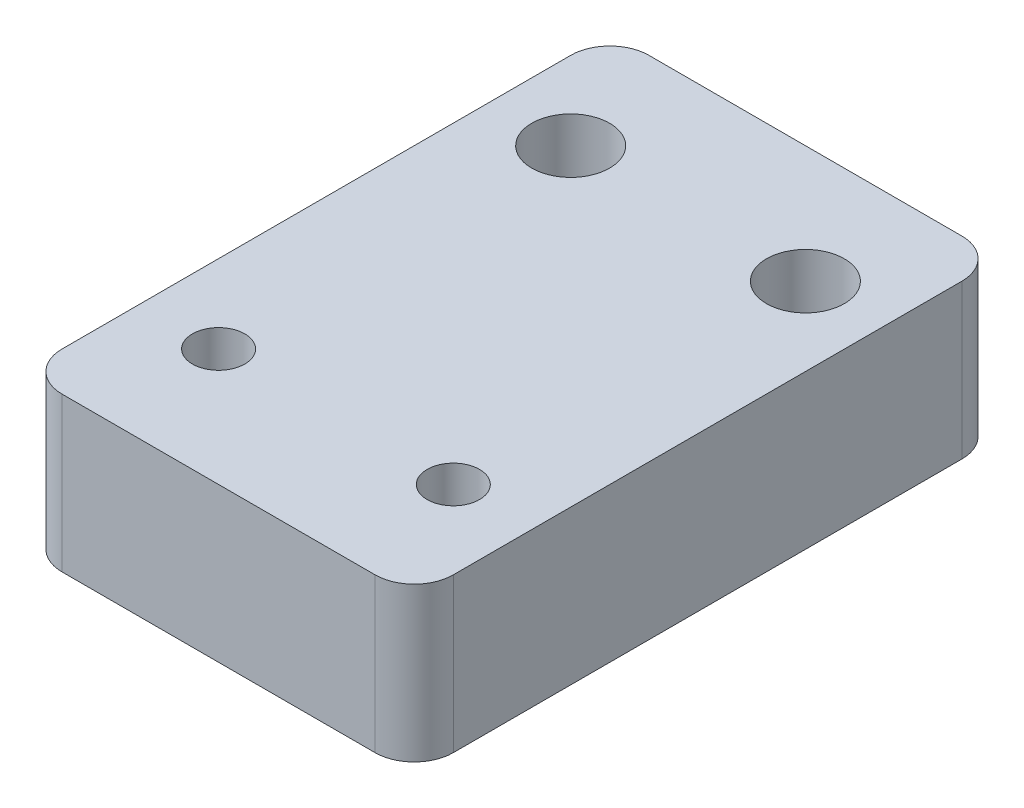
ISO-10303-21;
HEADER;
FILE_DESCRIPTION(('STEP AP214'),'2;1');
FILE_NAME('part.step','',(''),(''),'','','');
FILE_SCHEMA(('AUTOMOTIVE_DESIGN { 1 0 10303 214 1 1 1 1 }'));
ENDSEC;
DATA;
#1=APPLICATION_CONTEXT('core data for automotive mechanical design processes');
#2=APPLICATION_PROTOCOL_DEFINITION('international standard','automotive_design',2000,#1);
#3=PRODUCT_CONTEXT('',#1,'mechanical');
#4=PRODUCT('Part','Part','',(#3));
#5=PRODUCT_RELATED_PRODUCT_CATEGORY('part','',(#4));
#6=PRODUCT_DEFINITION_FORMATION('','',#4);
#7=PRODUCT_DEFINITION_CONTEXT('part definition',#1,'design');
#8=PRODUCT_DEFINITION('design','',#6,#7);
#9=PRODUCT_DEFINITION_SHAPE('','',#8);
#10=(LENGTH_UNIT() NAMED_UNIT(*) SI_UNIT(.MILLI.,.METRE.));
#11=(NAMED_UNIT(*) PLANE_ANGLE_UNIT() SI_UNIT($,.RADIAN.));
#12=(NAMED_UNIT(*) SI_UNIT($,.STERADIAN.) SOLID_ANGLE_UNIT());
#13=UNCERTAINTY_MEASURE_WITH_UNIT(LENGTH_MEASURE(1.E-05),#10,'distance_accuracy_value','');
#14=(GEOMETRIC_REPRESENTATION_CONTEXT(3) GLOBAL_UNCERTAINTY_ASSIGNED_CONTEXT((#13)) GLOBAL_UNIT_ASSIGNED_CONTEXT((#10,
#11,#12)) REPRESENTATION_CONTEXT('',''));
#15=CARTESIAN_POINT('',(0.,0.,0.));
#16=DIRECTION('',(0.,0.,1.));
#17=DIRECTION('',(1.,0.,0.));
#18=AXIS2_PLACEMENT_3D('',#15,#16,#17);
#19=CARTESIAN_POINT('',(0.,10.,0.));
#20=DIRECTION('',(0.,-1.,0.));
#21=DIRECTION('',(0.,0.,-1.));
#22=AXIS2_PLACEMENT_3D('',#19,#20,#21);
#23=PLANE('',#22);
#24=DIRECTION('',(1.,0.,0.));
#25=VECTOR('',#24,1.);
#26=CARTESIAN_POINT('',(-12.7,10.,19.05));
#27=LINE('',#26,#25);
#28=CARTESIAN_POINT('',(-10.16,10.,19.05));
#29=VERTEX_POINT('',#28);
#30=CARTESIAN_POINT('',(10.16,10.,19.05));
#31=VERTEX_POINT('',#30);
#32=EDGE_CURVE('E143',#29,#31,#27,.T.);
#33=ORIENTED_EDGE('',*,*,#32,.T.);
#34=CARTESIAN_POINT('',(10.16,10.,16.51));
#35=DIRECTION('',(0.,-1.,0.));
#36=DIRECTION('',(0.,0.,-1.));
#37=AXIS2_PLACEMENT_3D('',#34,#35,#36);
#38=CIRCLE('',#37,2.54);
#39=CARTESIAN_POINT('',(12.7,10.,16.51));
#40=VERTEX_POINT('',#39);
#41=EDGE_CURVE('E161',#31,#40,#38,.F.);
#42=ORIENTED_EDGE('',*,*,#41,.T.);
#43=DIRECTION('',(0.,0.,-1.));
#44=VECTOR('',#43,1.);
#45=CARTESIAN_POINT('',(12.7,10.,19.05));
#46=LINE('',#45,#44);
#47=CARTESIAN_POINT('',(12.7,10.,-16.51));
#48=VERTEX_POINT('',#47);
#49=EDGE_CURVE('E125',#40,#48,#46,.T.);
#50=ORIENTED_EDGE('',*,*,#49,.T.);
#51=CARTESIAN_POINT('',(10.16,10.,-16.51));
#52=DIRECTION('',(0.,-1.,0.));
#53=DIRECTION('',(0.,0.,-1.));
#54=AXIS2_PLACEMENT_3D('',#51,#52,#53);
#55=CIRCLE('',#54,2.54);
#56=CARTESIAN_POINT('',(10.16,10.,-19.05));
#57=VERTEX_POINT('',#56);
#58=EDGE_CURVE('E158',#48,#57,#55,.F.);
#59=ORIENTED_EDGE('',*,*,#58,.T.);
#60=DIRECTION('',(-1.,0.,0.));
#61=VECTOR('',#60,1.);
#62=CARTESIAN_POINT('',(-12.7,10.,-19.05));
#63=LINE('',#62,#61);
#64=CARTESIAN_POINT('',(-10.16,10.,-19.05));
#65=VERTEX_POINT('',#64);
#66=EDGE_CURVE('E172',#57,#65,#63,.T.);
#67=ORIENTED_EDGE('',*,*,#66,.T.);
#68=CARTESIAN_POINT('',(-10.16,10.,-16.51));
#69=DIRECTION('',(0.,-1.,0.));
#70=DIRECTION('',(0.,0.,-1.));
#71=AXIS2_PLACEMENT_3D('',#68,#69,#70);
#72=CIRCLE('',#71,2.54);
#73=CARTESIAN_POINT('',(-12.7,10.,-16.51));
#74=VERTEX_POINT('',#73);
#75=EDGE_CURVE('E61',#65,#74,#72,.F.);
#76=ORIENTED_EDGE('',*,*,#75,.T.);
#77=DIRECTION('',(0.,0.,1.));
#78=VECTOR('',#77,1.);
#79=CARTESIAN_POINT('',(-12.7,10.,19.05));
#80=LINE('',#79,#78);
#81=CARTESIAN_POINT('',(-12.7,10.,16.51));
#82=VERTEX_POINT('',#81);
#83=EDGE_CURVE('E180',#74,#82,#80,.T.);
#84=ORIENTED_EDGE('',*,*,#83,.T.);
#85=CARTESIAN_POINT('',(-10.16,10.,16.51));
#86=DIRECTION('',(0.,-1.,0.));
#87=DIRECTION('',(0.,0.,-1.));
#88=AXIS2_PLACEMENT_3D('',#85,#86,#87);
#89=CIRCLE('',#88,2.54);
#90=EDGE_CURVE('E156',#82,#29,#89,.F.);
#91=ORIENTED_EDGE('',*,*,#90,.T.);
#92=EDGE_LOOP('',(#33,#42,#50,#59,#67,#76,#84,#91));
#93=FACE_BOUND('',#92,.T.);
#94=CARTESIAN_POINT('',(-7.62,10.,11.43));
#95=DIRECTION('',(0.,1.,0.));
#96=DIRECTION('',(0.,0.,1.));
#97=AXIS2_PLACEMENT_3D('',#94,#95,#96);
#98=CIRCLE('',#97,1.7);
#99=CARTESIAN_POINT('',(-7.62,10.,13.13));
#100=VERTEX_POINT('',#99);
#101=EDGE_CURVE('E134',#100,#100,#98,.T.);
#102=ORIENTED_EDGE('',*,*,#101,.F.);
#103=EDGE_LOOP('',(#102));
#104=FACE_BOUND('',#103,.T.);
#105=CARTESIAN_POINT('',(7.62,10.,11.43));
#106=DIRECTION('',(0.,1.,0.));
#107=DIRECTION('',(0.,0.,1.));
#108=AXIS2_PLACEMENT_3D('',#105,#106,#107);
#109=CIRCLE('',#108,1.7);
#110=CARTESIAN_POINT('',(7.62,10.,13.13));
#111=VERTEX_POINT('',#110);
#112=EDGE_CURVE('E187',#111,#111,#109,.T.);
#113=ORIENTED_EDGE('',*,*,#112,.F.);
#114=EDGE_LOOP('',(#113));
#115=FACE_BOUND('',#114,.T.);
#116=CARTESIAN_POINT('',(-7.62,10.,-11.43));
#117=DIRECTION('',(0.,1.,0.));
#118=DIRECTION('',(0.,0.,1.));
#119=AXIS2_PLACEMENT_3D('',#116,#117,#118);
#120=CIRCLE('',#119,2.5273);
#121=CARTESIAN_POINT('',(-7.62,10.,-8.9027));
#122=VERTEX_POINT('',#121);
#123=EDGE_CURVE('E192',#122,#122,#120,.T.);
#124=ORIENTED_EDGE('',*,*,#123,.F.);
#125=EDGE_LOOP('',(#124));
#126=FACE_BOUND('',#125,.T.);
#127=CARTESIAN_POINT('',(7.62,10.,-11.43));
#128=DIRECTION('',(0.,1.,0.));
#129=DIRECTION('',(0.,0.,1.));
#130=AXIS2_PLACEMENT_3D('',#127,#128,#129);
#131=CIRCLE('',#130,2.5273);
#132=CARTESIAN_POINT('',(7.62,10.,-8.9027));
#133=VERTEX_POINT('',#132);
#134=EDGE_CURVE('E198',#133,#133,#131,.T.);
#135=ORIENTED_EDGE('',*,*,#134,.F.);
#136=EDGE_LOOP('',(#135));
#137=FACE_BOUND('',#136,.T.);
#138=ADVANCED_FACE('F39',(#93,#104,#115,#126,#137),#23,.F.);
#139=CARTESIAN_POINT('',(0.,0.,0.));
#140=DIRECTION('',(0.,-1.,0.));
#141=DIRECTION('',(0.,0.,-1.));
#142=AXIS2_PLACEMENT_3D('',#139,#140,#141);
#143=PLANE('',#142);
#144=CARTESIAN_POINT('',(-7.62,0.,-11.43));
#145=DIRECTION('',(0.,1.,0.));
#146=DIRECTION('',(0.,0.,1.));
#147=AXIS2_PLACEMENT_3D('',#144,#145,#146);
#148=CIRCLE('',#147,2.5273);
#149=CARTESIAN_POINT('',(-7.62,0.,-8.9027));
#150=VERTEX_POINT('',#149);
#151=EDGE_CURVE('E195',#150,#150,#148,.T.);
#152=ORIENTED_EDGE('',*,*,#151,.T.);
#153=EDGE_LOOP('',(#152));
#154=FACE_BOUND('',#153,.T.);
#155=CARTESIAN_POINT('',(-7.62,0.,11.43));
#156=DIRECTION('',(0.,1.,0.));
#157=DIRECTION('',(0.,0.,1.));
#158=AXIS2_PLACEMENT_3D('',#155,#156,#157);
#159=CIRCLE('',#158,1.7);
#160=CARTESIAN_POINT('',(-7.62,0.,13.13));
#161=VERTEX_POINT('',#160);
#162=EDGE_CURVE('E140',#161,#161,#159,.T.);
#163=ORIENTED_EDGE('',*,*,#162,.T.);
#164=EDGE_LOOP('',(#163));
#165=FACE_BOUND('',#164,.T.);
#166=DIRECTION('',(0.,0.,-1.));
#167=VECTOR('',#166,1.);
#168=CARTESIAN_POINT('',(12.7,0.,19.05));
#169=LINE('',#168,#167);
#170=CARTESIAN_POINT('',(12.7,0.,16.51));
#171=VERTEX_POINT('',#170);
#172=CARTESIAN_POINT('',(12.7,0.,-16.51));
#173=VERTEX_POINT('',#172);
#174=EDGE_CURVE('E122',#171,#173,#169,.T.);
#175=ORIENTED_EDGE('',*,*,#174,.F.);
#176=CARTESIAN_POINT('',(10.16,0.,16.51));
#177=DIRECTION('',(0.,-1.,0.));
#178=DIRECTION('',(0.,0.,-1.));
#179=AXIS2_PLACEMENT_3D('',#176,#177,#178);
#180=CIRCLE('',#179,2.54);
#181=CARTESIAN_POINT('',(10.16,0.,19.05));
#182=VERTEX_POINT('',#181);
#183=EDGE_CURVE('E105',#171,#182,#180,.T.);
#184=ORIENTED_EDGE('',*,*,#183,.T.);
#185=DIRECTION('',(1.,0.,0.));
#186=VECTOR('',#185,1.);
#187=CARTESIAN_POINT('',(-12.7,0.,19.05));
#188=LINE('',#187,#186);
#189=CARTESIAN_POINT('',(-10.16,0.,19.05));
#190=VERTEX_POINT('',#189);
#191=EDGE_CURVE('E147',#190,#182,#188,.T.);
#192=ORIENTED_EDGE('',*,*,#191,.F.);
#193=CARTESIAN_POINT('',(-10.16,0.,16.51));
#194=DIRECTION('',(0.,-1.,0.));
#195=DIRECTION('',(0.,0.,-1.));
#196=AXIS2_PLACEMENT_3D('',#193,#194,#195);
#197=CIRCLE('',#196,2.54);
#198=CARTESIAN_POINT('',(-12.7,0.,16.51));
#199=VERTEX_POINT('',#198);
#200=EDGE_CURVE('E126',#190,#199,#197,.T.);
#201=ORIENTED_EDGE('',*,*,#200,.T.);
#202=DIRECTION('',(0.,0.,1.));
#203=VECTOR('',#202,1.);
#204=CARTESIAN_POINT('',(-12.7,0.,19.05));
#205=LINE('',#204,#203);
#206=CARTESIAN_POINT('',(-12.7,0.,-16.51));
#207=VERTEX_POINT('',#206);
#208=EDGE_CURVE('E137',#207,#199,#205,.T.);
#209=ORIENTED_EDGE('',*,*,#208,.F.);
#210=CARTESIAN_POINT('',(-10.16,0.,-16.51));
#211=DIRECTION('',(0.,-1.,0.));
#212=DIRECTION('',(0.,0.,-1.));
#213=AXIS2_PLACEMENT_3D('',#210,#211,#212);
#214=CIRCLE('',#213,2.54);
#215=CARTESIAN_POINT('',(-10.16,0.,-19.05));
#216=VERTEX_POINT('',#215);
#217=EDGE_CURVE('E116',#207,#216,#214,.T.);
#218=ORIENTED_EDGE('',*,*,#217,.T.);
#219=DIRECTION('',(-1.,0.,0.));
#220=VECTOR('',#219,1.);
#221=CARTESIAN_POINT('',(-12.7,0.,-19.05));
#222=LINE('',#221,#220);
#223=CARTESIAN_POINT('',(10.16,0.,-19.05));
#224=VERTEX_POINT('',#223);
#225=EDGE_CURVE('E133',#224,#216,#222,.T.);
#226=ORIENTED_EDGE('',*,*,#225,.F.);
#227=CARTESIAN_POINT('',(10.16,0.,-16.51));
#228=DIRECTION('',(0.,-1.,0.));
#229=DIRECTION('',(0.,0.,-1.));
#230=AXIS2_PLACEMENT_3D('',#227,#228,#229);
#231=CIRCLE('',#230,2.54);
#232=EDGE_CURVE('E132',#224,#173,#231,.T.);
#233=ORIENTED_EDGE('',*,*,#232,.T.);
#234=EDGE_LOOP('',(#175,#184,#192,#201,#209,#218,#226,#233));
#235=FACE_BOUND('',#234,.T.);
#236=CARTESIAN_POINT('',(7.62,0.,11.43));
#237=DIRECTION('',(0.,1.,0.));
#238=DIRECTION('',(0.,0.,1.));
#239=AXIS2_PLACEMENT_3D('',#236,#237,#238);
#240=CIRCLE('',#239,1.7);
#241=CARTESIAN_POINT('',(7.62,0.,13.13));
#242=VERTEX_POINT('',#241);
#243=EDGE_CURVE('E189',#242,#242,#240,.T.);
#244=ORIENTED_EDGE('',*,*,#243,.T.);
#245=EDGE_LOOP('',(#244));
#246=FACE_BOUND('',#245,.T.);
#247=CARTESIAN_POINT('',(7.62,0.,-11.43));
#248=DIRECTION('',(0.,1.,0.));
#249=DIRECTION('',(0.,0.,1.));
#250=AXIS2_PLACEMENT_3D('',#247,#248,#249);
#251=CIRCLE('',#250,2.5273);
#252=CARTESIAN_POINT('',(7.62,0.,-8.9027));
#253=VERTEX_POINT('',#252);
#254=EDGE_CURVE('E201',#253,#253,#251,.T.);
#255=ORIENTED_EDGE('',*,*,#254,.T.);
#256=EDGE_LOOP('',(#255));
#257=FACE_BOUND('',#256,.T.);
#258=ADVANCED_FACE('F129',(#154,#165,#235,#246,#257),#143,.T.);
#259=CARTESIAN_POINT('',(12.7,10.,19.05));
#260=DIRECTION('',(-1.,0.,0.));
#261=DIRECTION('',(0.,0.,1.));
#262=AXIS2_PLACEMENT_3D('',#259,#260,#261);
#263=PLANE('',#262);
#264=ORIENTED_EDGE('',*,*,#49,.F.);
#265=DIRECTION('',(0.,-1.,0.));
#266=VECTOR('',#265,1.);
#267=CARTESIAN_POINT('',(12.7,10.,16.51));
#268=LINE('',#267,#266);
#269=EDGE_CURVE('E109',#40,#171,#268,.T.);
#270=ORIENTED_EDGE('',*,*,#269,.T.);
#271=ORIENTED_EDGE('',*,*,#174,.T.);
#272=DIRECTION('',(0.,-1.,0.));
#273=VECTOR('',#272,1.);
#274=CARTESIAN_POINT('',(12.7,10.,-16.51));
#275=LINE('',#274,#273);
#276=EDGE_CURVE('E127',#173,#48,#275,.F.);
#277=ORIENTED_EDGE('',*,*,#276,.T.);
#278=EDGE_LOOP('',(#264,#270,#271,#277));
#279=FACE_BOUND('',#278,.T.);
#280=ADVANCED_FACE('F121',(#279),#263,.F.);
#281=CARTESIAN_POINT('',(-12.7,10.,-19.05));
#282=DIRECTION('',(0.,0.,1.));
#283=DIRECTION('',(1.,0.,0.));
#284=AXIS2_PLACEMENT_3D('',#281,#282,#283);
#285=PLANE('',#284);
#286=ORIENTED_EDGE('',*,*,#225,.T.);
#287=DIRECTION('',(0.,-1.,0.));
#288=VECTOR('',#287,1.);
#289=CARTESIAN_POINT('',(-10.16,10.,-19.05));
#290=LINE('',#289,#288);
#291=EDGE_CURVE('E11',#216,#65,#290,.F.);
#292=ORIENTED_EDGE('',*,*,#291,.T.);
#293=ORIENTED_EDGE('',*,*,#66,.F.);
#294=DIRECTION('',(0.,-1.,0.));
#295=VECTOR('',#294,1.);
#296=CARTESIAN_POINT('',(10.16,10.,-19.05));
#297=LINE('',#296,#295);
#298=EDGE_CURVE('E47',#57,#224,#297,.T.);
#299=ORIENTED_EDGE('',*,*,#298,.T.);
#300=EDGE_LOOP('',(#286,#292,#293,#299));
#301=FACE_BOUND('',#300,.T.);
#302=ADVANCED_FACE('F170',(#301),#285,.F.);
#303=CARTESIAN_POINT('',(-12.7,10.,19.05));
#304=DIRECTION('',(1.,0.,0.));
#305=DIRECTION('',(0.,0.,-1.));
#306=AXIS2_PLACEMENT_3D('',#303,#304,#305);
#307=PLANE('',#306);
#308=ORIENTED_EDGE('',*,*,#83,.F.);
#309=DIRECTION('',(0.,-1.,0.));
#310=VECTOR('',#309,1.);
#311=CARTESIAN_POINT('',(-12.7,10.,-16.51));
#312=LINE('',#311,#310);
#313=EDGE_CURVE('E164',#74,#207,#312,.T.);
#314=ORIENTED_EDGE('',*,*,#313,.T.);
#315=ORIENTED_EDGE('',*,*,#208,.T.);
#316=DIRECTION('',(0.,-1.,0.));
#317=VECTOR('',#316,1.);
#318=CARTESIAN_POINT('',(-12.7,10.,16.51));
#319=LINE('',#318,#317);
#320=EDGE_CURVE('E54',#199,#82,#319,.F.);
#321=ORIENTED_EDGE('',*,*,#320,.T.);
#322=EDGE_LOOP('',(#308,#314,#315,#321));
#323=FACE_BOUND('',#322,.T.);
#324=ADVANCED_FACE('F179',(#323),#307,.F.);
#325=CARTESIAN_POINT('',(-12.7,10.,19.05));
#326=DIRECTION('',(0.,0.,-1.));
#327=DIRECTION('',(-1.,0.,0.));
#328=AXIS2_PLACEMENT_3D('',#325,#326,#327);
#329=PLANE('',#328);
#330=ORIENTED_EDGE('',*,*,#191,.T.);
#331=DIRECTION('',(0.,-1.,0.));
#332=VECTOR('',#331,1.);
#333=CARTESIAN_POINT('',(10.16,10.,19.05));
#334=LINE('',#333,#332);
#335=EDGE_CURVE('E110',#182,#31,#334,.F.);
#336=ORIENTED_EDGE('',*,*,#335,.T.);
#337=ORIENTED_EDGE('',*,*,#32,.F.);
#338=DIRECTION('',(0.,-1.,0.));
#339=VECTOR('',#338,1.);
#340=CARTESIAN_POINT('',(-10.16,10.,19.05));
#341=LINE('',#340,#339);
#342=EDGE_CURVE('E115',#29,#190,#341,.T.);
#343=ORIENTED_EDGE('',*,*,#342,.T.);
#344=EDGE_LOOP('',(#330,#336,#337,#343));
#345=FACE_BOUND('',#344,.T.);
#346=ADVANCED_FACE('F223',(#345),#329,.F.);
#347=CARTESIAN_POINT('',(-7.62,10.,11.43));
#348=DIRECTION('',(0.,-1.,0.));
#349=DIRECTION('',(0.,0.,-1.));
#350=AXIS2_PLACEMENT_3D('',#347,#348,#349);
#351=CYLINDRICAL_SURFACE('',#350,1.7);
#352=ORIENTED_EDGE('',*,*,#101,.T.);
#353=EDGE_LOOP('',(#352));
#354=FACE_BOUND('',#353,.T.);
#355=ORIENTED_EDGE('',*,*,#162,.F.);
#356=EDGE_LOOP('',(#355));
#357=FACE_BOUND('',#356,.T.);
#358=ADVANCED_FACE('F220',(#354,#357),#351,.F.);
#359=CARTESIAN_POINT('',(7.62,10.,11.43));
#360=DIRECTION('',(0.,-1.,0.));
#361=DIRECTION('',(0.,0.,-1.));
#362=AXIS2_PLACEMENT_3D('',#359,#360,#361);
#363=CYLINDRICAL_SURFACE('',#362,1.7);
#364=ORIENTED_EDGE('',*,*,#112,.T.);
#365=EDGE_LOOP('',(#364));
#366=FACE_BOUND('',#365,.T.);
#367=ORIENTED_EDGE('',*,*,#243,.F.);
#368=EDGE_LOOP('',(#367));
#369=FACE_BOUND('',#368,.T.);
#370=ADVANCED_FACE('F280',(#366,#369),#363,.F.);
#371=CARTESIAN_POINT('',(-7.62,10.,-11.43));
#372=DIRECTION('',(0.,-1.,0.));
#373=DIRECTION('',(0.,0.,-1.));
#374=AXIS2_PLACEMENT_3D('',#371,#372,#373);
#375=CYLINDRICAL_SURFACE('',#374,2.5273);
#376=ORIENTED_EDGE('',*,*,#123,.T.);
#377=EDGE_LOOP('',(#376));
#378=FACE_BOUND('',#377,.T.);
#379=ORIENTED_EDGE('',*,*,#151,.F.);
#380=EDGE_LOOP('',(#379));
#381=FACE_BOUND('',#380,.T.);
#382=ADVANCED_FACE('F271',(#378,#381),#375,.F.);
#383=CARTESIAN_POINT('',(7.62,10.,-11.43));
#384=DIRECTION('',(0.,-1.,0.));
#385=DIRECTION('',(0.,0.,-1.));
#386=AXIS2_PLACEMENT_3D('',#383,#384,#385);
#387=CYLINDRICAL_SURFACE('',#386,2.5273);
#388=ORIENTED_EDGE('',*,*,#134,.T.);
#389=EDGE_LOOP('',(#388));
#390=FACE_BOUND('',#389,.T.);
#391=ORIENTED_EDGE('',*,*,#254,.F.);
#392=EDGE_LOOP('',(#391));
#393=FACE_BOUND('',#392,.T.);
#394=ADVANCED_FACE('F207',(#390,#393),#387,.F.);
#395=CARTESIAN_POINT('',(10.16,10.,16.51));
#396=DIRECTION('',(0.,-1.,0.));
#397=DIRECTION('',(0.,0.,-1.));
#398=AXIS2_PLACEMENT_3D('',#395,#396,#397);
#399=CYLINDRICAL_SURFACE('',#398,2.54);
#400=ORIENTED_EDGE('',*,*,#41,.F.);
#401=ORIENTED_EDGE('',*,*,#335,.F.);
#402=ORIENTED_EDGE('',*,*,#183,.F.);
#403=ORIENTED_EDGE('',*,*,#269,.F.);
#404=EDGE_LOOP('',(#400,#401,#402,#403));
#405=FACE_BOUND('',#404,.T.);
#406=ADVANCED_FACE('F108',(#405),#399,.T.);
#407=CARTESIAN_POINT('',(-10.16,10.,-16.51));
#408=DIRECTION('',(0.,-1.,0.));
#409=DIRECTION('',(0.,0.,-1.));
#410=AXIS2_PLACEMENT_3D('',#407,#408,#409);
#411=CYLINDRICAL_SURFACE('',#410,2.54);
#412=ORIENTED_EDGE('',*,*,#75,.F.);
#413=ORIENTED_EDGE('',*,*,#291,.F.);
#414=ORIENTED_EDGE('',*,*,#217,.F.);
#415=ORIENTED_EDGE('',*,*,#313,.F.);
#416=EDGE_LOOP('',(#412,#413,#414,#415));
#417=FACE_BOUND('',#416,.T.);
#418=ADVANCED_FACE('F178',(#417),#411,.T.);
#419=CARTESIAN_POINT('',(10.16,10.,-16.51));
#420=DIRECTION('',(0.,-1.,0.));
#421=DIRECTION('',(0.,0.,-1.));
#422=AXIS2_PLACEMENT_3D('',#419,#420,#421);
#423=CYLINDRICAL_SURFACE('',#422,2.54);
#424=ORIENTED_EDGE('',*,*,#58,.F.);
#425=ORIENTED_EDGE('',*,*,#276,.F.);
#426=ORIENTED_EDGE('',*,*,#232,.F.);
#427=ORIENTED_EDGE('',*,*,#298,.F.);
#428=EDGE_LOOP('',(#424,#425,#426,#427));
#429=FACE_BOUND('',#428,.T.);
#430=ADVANCED_FACE('F236',(#429),#423,.T.);
#431=CARTESIAN_POINT('',(-10.16,10.,16.51));
#432=DIRECTION('',(0.,-1.,0.));
#433=DIRECTION('',(0.,0.,-1.));
#434=AXIS2_PLACEMENT_3D('',#431,#432,#433);
#435=CYLINDRICAL_SURFACE('',#434,2.54);
#436=ORIENTED_EDGE('',*,*,#90,.F.);
#437=ORIENTED_EDGE('',*,*,#320,.F.);
#438=ORIENTED_EDGE('',*,*,#200,.F.);
#439=ORIENTED_EDGE('',*,*,#342,.F.);
#440=EDGE_LOOP('',(#436,#437,#438,#439));
#441=FACE_BOUND('',#440,.T.);
#442=ADVANCED_FACE('F41',(#441),#435,.T.);
#443=CLOSED_SHELL('',(#138,#258,#280,#302,#324,#346,#358,#370,#382,#394,#406,#418,#430,#442));
#444=MANIFOLD_SOLID_BREP('B2',#443);
#445=ADVANCED_BREP_SHAPE_REPRESENTATION('',(#18,#444),#14);
#446=SHAPE_DEFINITION_REPRESENTATION(#9,#445);
ENDSEC;
END-ISO-10303-21;
